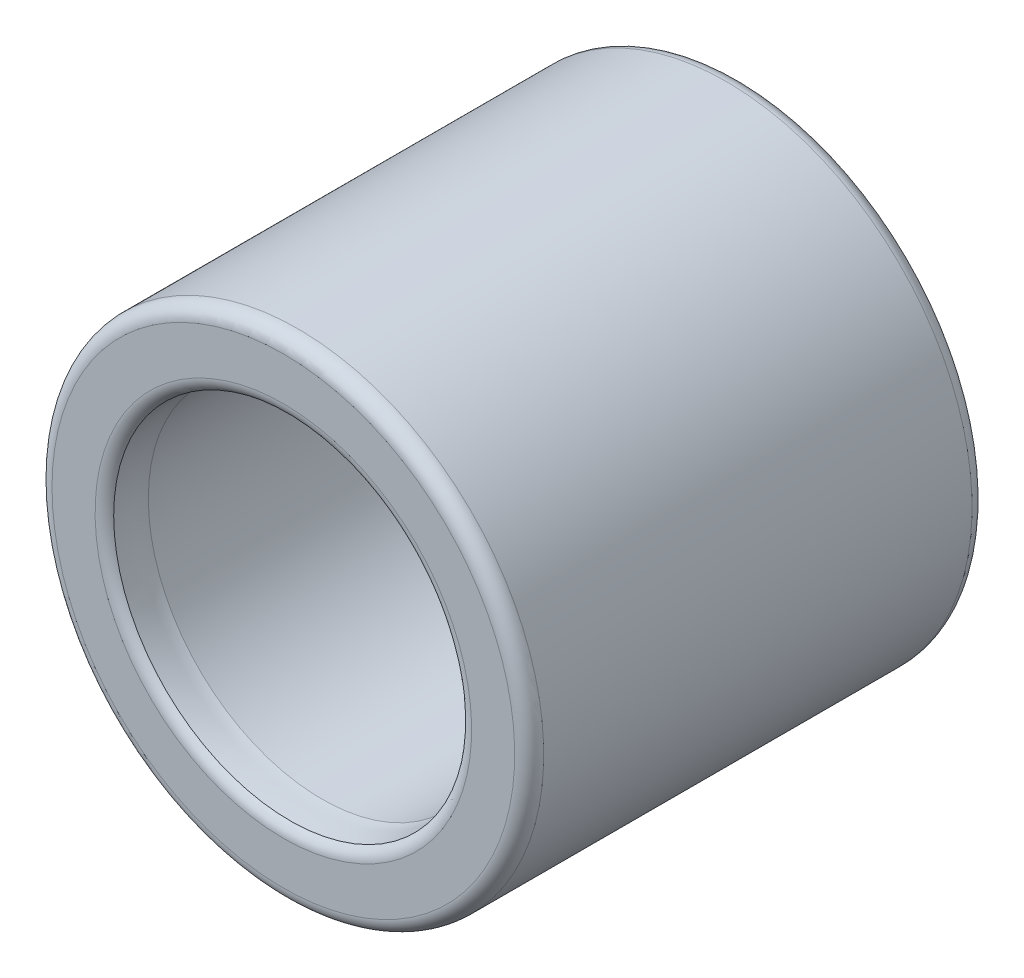
ISO-10303-21;
HEADER;
FILE_DESCRIPTION(('STEP AP214'),'2;1');
FILE_NAME('part.step','',(''),(''),'','','');
FILE_SCHEMA(('AUTOMOTIVE_DESIGN { 1 0 10303 214 1 1 1 1 }'));
ENDSEC;
DATA;
#1=APPLICATION_CONTEXT('core data for automotive mechanical design processes');
#2=APPLICATION_PROTOCOL_DEFINITION('international standard','automotive_design',2000,#1);
#3=PRODUCT_CONTEXT('',#1,'mechanical');
#4=PRODUCT('Part','Part','',(#3));
#5=PRODUCT_RELATED_PRODUCT_CATEGORY('part','',(#4));
#6=PRODUCT_DEFINITION_FORMATION('','',#4);
#7=PRODUCT_DEFINITION_CONTEXT('part definition',#1,'design');
#8=PRODUCT_DEFINITION('design','',#6,#7);
#9=PRODUCT_DEFINITION_SHAPE('','',#8);
#10=(LENGTH_UNIT() NAMED_UNIT(*) SI_UNIT(.MILLI.,.METRE.));
#11=(NAMED_UNIT(*) PLANE_ANGLE_UNIT() SI_UNIT($,.RADIAN.));
#12=(NAMED_UNIT(*) SI_UNIT($,.STERADIAN.) SOLID_ANGLE_UNIT());
#13=UNCERTAINTY_MEASURE_WITH_UNIT(LENGTH_MEASURE(1.E-05),#10,'distance_accuracy_value','');
#14=(GEOMETRIC_REPRESENTATION_CONTEXT(3) GLOBAL_UNCERTAINTY_ASSIGNED_CONTEXT((#13)) GLOBAL_UNIT_ASSIGNED_CONTEXT((#10,
#11,#12)) REPRESENTATION_CONTEXT('',''));
#15=CARTESIAN_POINT('',(0.,0.,0.));
#16=DIRECTION('',(0.,0.,1.));
#17=DIRECTION('',(1.,0.,0.));
#18=AXIS2_PLACEMENT_3D('',#15,#16,#17);
#19=CARTESIAN_POINT('',(-23.8125,0.,-4.425));
#20=DIRECTION('',(0.,0.,-1.));
#21=DIRECTION('',(-1.,0.,0.));
#22=AXIS2_PLACEMENT_3D('',#19,#20,#21);
#23=CYLINDRICAL_SURFACE('',#22,3.59);
#24=CARTESIAN_POINT('',(-23.8125,0.,3.925));
#25=DIRECTION('',(0.,0.,1.));
#26=DIRECTION('',(-1.,0.,0.));
#27=AXIS2_PLACEMENT_3D('',#24,#25,#26);
#28=CIRCLE('',#27,3.59);
#29=CARTESIAN_POINT('',(-27.4025,0.,3.925));
#30=VERTEX_POINT('',#29);
#31=EDGE_CURVE('E138',#30,#30,#28,.T.);
#32=ORIENTED_EDGE('',*,*,#31,.T.);
#33=EDGE_LOOP('',(#32));
#34=FACE_BOUND('',#33,.T.);
#35=CARTESIAN_POINT('',(-23.8125,0.,-4.425));
#36=DIRECTION('',(0.,0.,1.));
#37=DIRECTION('',(-0.0428192164370875,-0.99908283675765,0.));
#38=AXIS2_PLACEMENT_3D('',#35,#36,#37);
#39=CIRCLE('',#38,3.59);
#40=CARTESIAN_POINT('',(-23.9662209870091,-3.58670738395997,-4.425));
#41=VERTEX_POINT('',#40);
#42=EDGE_CURVE('E18',#41,#41,#39,.T.);
#43=ORIENTED_EDGE('',*,*,#42,.F.);
#44=EDGE_LOOP('',(#43));
#45=FACE_BOUND('',#44,.T.);
#46=ADVANCED_FACE('F15',(#34,#45),#23,.F.);
#47=CARTESIAN_POINT('',(-27.4525,0.,4.590831239518));
#48=CARTESIAN_POINT('',(-27.44865403217,0.,4.560959935559));
#49=CARTESIAN_POINT('',(-27.43550047051,0.,4.425463320624));
#50=CARTESIAN_POINT('',(-27.43563477904,0.,4.202296091407));
#51=CARTESIAN_POINT('',(-27.41981582109,0.,4.010457870099));
#52=CARTESIAN_POINT('',(-27.4025,0.,3.925));
#53=(BOUNDED_CURVE() B_SPLINE_CURVE(3,(#47,#48,#49,#50,#51,#52),.UNSPECIFIED.,.F.,
.F.) B_SPLINE_CURVE_WITH_KNOTS((4,1,1,4),(0.,0.1350800609694,0.6113546558718,1.),
.UNSPECIFIED.) CURVE() GEOMETRIC_REPRESENTATION_ITEM() RATIONAL_B_SPLINE_CURVE((1.,1.,1.,1.,1.,1.)) REPRESENTATION_ITEM(''));
#54=CARTESIAN_POINT('',(-23.8125,0.,4.590831239518));
#55=DIRECTION('',(0.,0.,1.));
#56=AXIS1_PLACEMENT('',#54,#55);
#57=SURFACE_OF_REVOLUTION('',#53,#56);
#58=CARTESIAN_POINT('',(-23.8125,0.,4.59083123951747));
#59=DIRECTION('',(0.,0.,1.));
#60=DIRECTION('',(-0.0608081456169594,0.998149472487276,0.));
#61=AXIS2_PLACEMENT_3D('',#58,#59,#60);
#62=CIRCLE('',#61,3.6400000000008);
#63=CARTESIAN_POINT('',(-24.0338416500458,3.63326407985448,4.59083123951747));
#64=VERTEX_POINT('',#63);
#65=EDGE_CURVE('E144',#64,#64,#62,.F.);
#66=ORIENTED_EDGE('',*,*,#65,.F.);
#67=EDGE_LOOP('',(#66));
#68=FACE_BOUND('',#67,.T.);
#69=ORIENTED_EDGE('',*,*,#31,.F.);
#70=EDGE_LOOP('',(#69));
#71=FACE_BOUND('',#70,.T.);
#72=ADVANCED_FACE('F124',(#68,#71),#57,.T.);
#73=CARTESIAN_POINT('',(-23.8125,0.,-4.425));
#74=DIRECTION('',(0.,0.,1.));
#75=DIRECTION('',(-0.0428192164370875,-0.99908283675765,0.));
#76=AXIS2_PLACEMENT_3D('',#73,#74,#75);
#77=TOROIDAL_SURFACE('',#76,3.89,0.3);
#78=ORIENTED_EDGE('',*,*,#42,.T.);
#79=EDGE_LOOP('',(#78));
#80=FACE_BOUND('',#79,.T.);
#81=CARTESIAN_POINT('',(-23.8125,0.,-4.725));
#82=DIRECTION('',(0.,0.,-1.));
#83=DIRECTION('',(0.,1.,0.));
#84=AXIS2_PLACEMENT_3D('',#81,#82,#83);
#85=CIRCLE('',#84,3.890000026239);
#86=CARTESIAN_POINT('',(-23.8125,3.890000026239,-4.725));
#87=VERTEX_POINT('',#86);
#88=EDGE_CURVE('E146',#87,#87,#85,.T.);
#89=ORIENTED_EDGE('',*,*,#88,.T.);
#90=EDGE_LOOP('',(#89));
#91=FACE_BOUND('',#90,.T.);
#92=ADVANCED_FACE('F121',(#80,#91),#77,.T.);
#93=CARTESIAN_POINT('',(-23.8125,0.,4.425));
#94=DIRECTION('',(0.,0.,1.));
#95=DIRECTION('',(-0.0608081456169589,0.998149472487276,0.));
#96=AXIS2_PLACEMENT_3D('',#93,#94,#95);
#97=TOROIDAL_SURFACE('',#96,3.890000000001,0.3);
#98=CARTESIAN_POINT('',(-23.8125,0.,4.725));
#99=DIRECTION('',(0.,0.,1.));
#100=DIRECTION('',(0.,-1.,0.));
#101=AXIS2_PLACEMENT_3D('',#98,#99,#100);
#102=CIRCLE('',#101,3.890000021868);
#103=CARTESIAN_POINT('',(-23.8125,-3.890000021868,4.725));
#104=VERTEX_POINT('',#103);
#105=EDGE_CURVE('E108',#104,#104,#102,.F.);
#106=ORIENTED_EDGE('',*,*,#105,.F.);
#107=EDGE_LOOP('',(#106));
#108=FACE_BOUND('',#107,.T.);
#109=ORIENTED_EDGE('',*,*,#65,.T.);
#110=EDGE_LOOP('',(#109));
#111=FACE_BOUND('',#110,.T.);
#112=ADVANCED_FACE('F78',(#108,#111),#97,.T.);
#113=CARTESIAN_POINT('',(-23.8125,0.,-4.725));
#114=DIRECTION('',(0.,0.,1.));
#115=DIRECTION('',(1.,0.,0.));
#116=AXIS2_PLACEMENT_3D('',#113,#114,#115);
#117=PLANE('',#116);
#118=ORIENTED_EDGE('',*,*,#88,.F.);
#119=EDGE_LOOP('',(#118));
#120=FACE_BOUND('',#119,.T.);
#121=CARTESIAN_POINT('',(-23.8125,0.,-4.72499999999997));
#122=DIRECTION('',(0.,0.,1.));
#123=DIRECTION('',(0.,1.,0.));
#124=AXIS2_PLACEMENT_3D('',#121,#122,#123);
#125=CIRCLE('',#124,4.779999854765);
#126=CARTESIAN_POINT('',(-23.8125,4.779999854765,-4.72499999999997));
#127=VERTEX_POINT('',#126);
#128=EDGE_CURVE('E61',#127,#127,#125,.T.);
#129=ORIENTED_EDGE('',*,*,#128,.F.);
#130=EDGE_LOOP('',(#129));
#131=FACE_BOUND('',#130,.T.);
#132=ADVANCED_FACE('F68',(#120,#131),#117,.F.);
#133=CARTESIAN_POINT('',(-23.8125,0.,4.725));
#134=DIRECTION('',(0.,0.,1.));
#135=DIRECTION('',(1.,0.,0.));
#136=AXIS2_PLACEMENT_3D('',#133,#134,#135);
#137=PLANE('',#136);
#138=ORIENTED_EDGE('',*,*,#105,.T.);
#139=EDGE_LOOP('',(#138));
#140=FACE_BOUND('',#139,.T.);
#141=CARTESIAN_POINT('',(-23.8125,0.,4.72499999999996));
#142=DIRECTION('',(0.,0.,-1.));
#143=DIRECTION('',(0.,1.,0.));
#144=AXIS2_PLACEMENT_3D('',#141,#142,#143);
#145=CIRCLE('',#144,4.779999853959);
#146=CARTESIAN_POINT('',(-23.8125,4.779999853959,4.72499999999996));
#147=VERTEX_POINT('',#146);
#148=EDGE_CURVE('E27',#147,#147,#145,.T.);
#149=ORIENTED_EDGE('',*,*,#148,.F.);
#150=EDGE_LOOP('',(#149));
#151=FACE_BOUND('',#150,.T.);
#152=ADVANCED_FACE('F77',(#140,#151),#137,.T.);
#153=CARTESIAN_POINT('',(-23.8125,0.,-4.425));
#154=DIRECTION('',(0.,0.,1.));
#155=DIRECTION('',(0.0429859633849392,-0.999075676288773,0.));
#156=AXIS2_PLACEMENT_3D('',#153,#154,#155);
#157=TOROIDAL_SURFACE('',#156,4.78,0.3);
#158=CARTESIAN_POINT('',(-23.8125,0.,-4.425));
#159=DIRECTION('',(0.,0.,-1.));
#160=DIRECTION('',(-1.,0.,0.));
#161=AXIS2_PLACEMENT_3D('',#158,#159,#160);
#162=CIRCLE('',#161,5.08);
#163=CARTESIAN_POINT('',(-28.8925,0.,-4.425));
#164=VERTEX_POINT('',#163);
#165=EDGE_CURVE('E22',#164,#164,#162,.F.);
#166=ORIENTED_EDGE('',*,*,#165,.F.);
#167=EDGE_LOOP('',(#166));
#168=FACE_BOUND('',#167,.T.);
#169=ORIENTED_EDGE('',*,*,#128,.T.);
#170=EDGE_LOOP('',(#169));
#171=FACE_BOUND('',#170,.T.);
#172=ADVANCED_FACE('F41',(#168,#171),#157,.T.);
#173=CARTESIAN_POINT('',(-23.8125,0.,4.425));
#174=DIRECTION('',(0.,0.,1.));
#175=DIRECTION('',(-0.0302646692782393,-0.999541919978086,0.));
#176=AXIS2_PLACEMENT_3D('',#173,#174,#175);
#177=TOROIDAL_SURFACE('',#176,4.78,0.3);
#178=CARTESIAN_POINT('',(-23.8125,0.,4.425));
#179=DIRECTION('',(0.,0.,-1.));
#180=DIRECTION('',(-1.,0.,0.));
#181=AXIS2_PLACEMENT_3D('',#178,#179,#180);
#182=CIRCLE('',#181,5.08);
#183=CARTESIAN_POINT('',(-28.8925,0.,4.425));
#184=VERTEX_POINT('',#183);
#185=EDGE_CURVE('E10',#184,#184,#182,.T.);
#186=ORIENTED_EDGE('',*,*,#185,.F.);
#187=EDGE_LOOP('',(#186));
#188=FACE_BOUND('',#187,.T.);
#189=ORIENTED_EDGE('',*,*,#148,.T.);
#190=EDGE_LOOP('',(#189));
#191=FACE_BOUND('',#190,.T.);
#192=ADVANCED_FACE('F35',(#188,#191),#177,.T.);
#193=CARTESIAN_POINT('',(-23.8125,0.,-4.425));
#194=DIRECTION('',(0.,0.,-1.));
#195=DIRECTION('',(-1.,0.,0.));
#196=AXIS2_PLACEMENT_3D('',#193,#194,#195);
#197=CYLINDRICAL_SURFACE('',#196,5.08);
#198=ORIENTED_EDGE('',*,*,#165,.T.);
#199=EDGE_LOOP('',(#198));
#200=FACE_BOUND('',#199,.T.);
#201=ORIENTED_EDGE('',*,*,#185,.T.);
#202=EDGE_LOOP('',(#201));
#203=FACE_BOUND('',#202,.T.);
#204=ADVANCED_FACE('F40',(#200,#203),#197,.T.);
#205=CLOSED_SHELL('',(#46,#72,#92,#112,#132,#152,#172,#192,#204));
#206=MANIFOLD_SOLID_BREP('B1',#205);
#207=ADVANCED_BREP_SHAPE_REPRESENTATION('',(#18,#206),#14);
#208=SHAPE_DEFINITION_REPRESENTATION(#9,#207);
ENDSEC;
END-ISO-10303-21;
